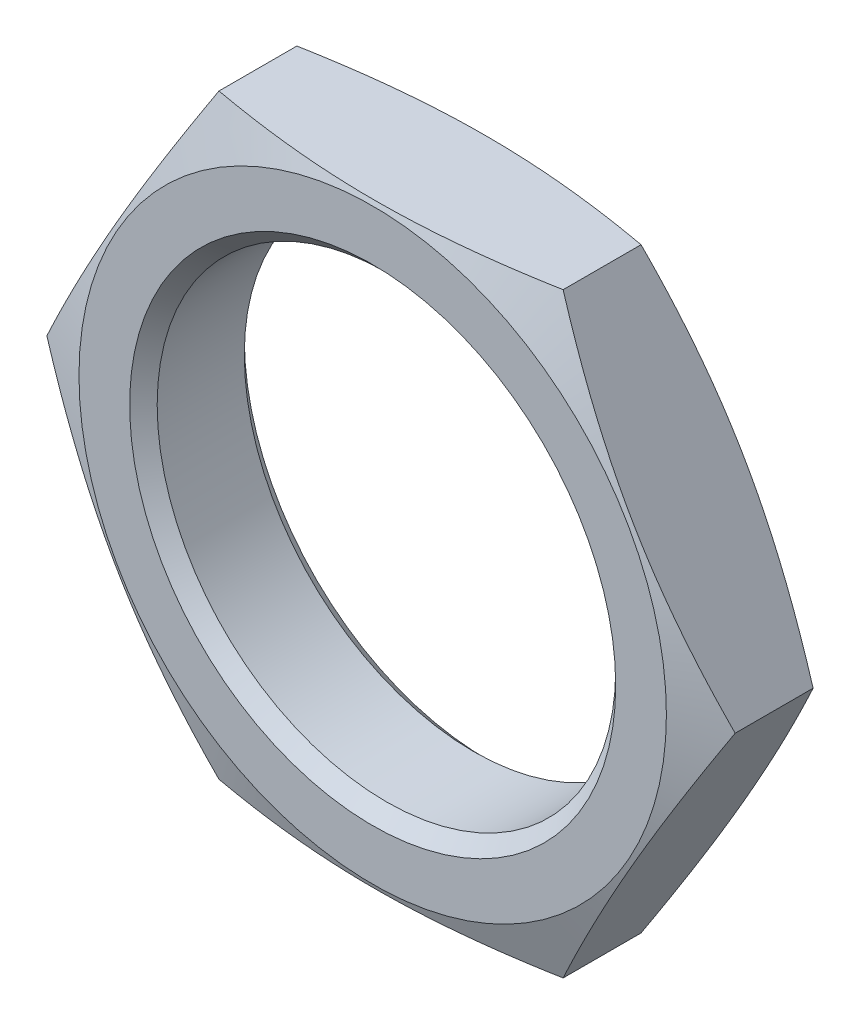
ISO-10303-21;
HEADER;
FILE_DESCRIPTION(('STEP AP214'),'2;1');
FILE_NAME('part.step','',(''),(''),'','','');
FILE_SCHEMA(('AUTOMOTIVE_DESIGN { 1 0 10303 214 1 1 1 1 }'));
ENDSEC;
DATA;
#1=APPLICATION_CONTEXT('core data for automotive mechanical design processes');
#2=APPLICATION_PROTOCOL_DEFINITION('international standard','automotive_design',2000,#1);
#3=PRODUCT_CONTEXT('',#1,'mechanical');
#4=PRODUCT('Part','Part','',(#3));
#5=PRODUCT_RELATED_PRODUCT_CATEGORY('part','',(#4));
#6=PRODUCT_DEFINITION_FORMATION('','',#4);
#7=PRODUCT_DEFINITION_CONTEXT('part definition',#1,'design');
#8=PRODUCT_DEFINITION('design','',#6,#7);
#9=PRODUCT_DEFINITION_SHAPE('','',#8);
#10=(LENGTH_UNIT() NAMED_UNIT(*) SI_UNIT(.MILLI.,.METRE.));
#11=(NAMED_UNIT(*) PLANE_ANGLE_UNIT() SI_UNIT($,.RADIAN.));
#12=(NAMED_UNIT(*) SI_UNIT($,.STERADIAN.) SOLID_ANGLE_UNIT());
#13=UNCERTAINTY_MEASURE_WITH_UNIT(LENGTH_MEASURE(1.E-05),#10,'distance_accuracy_value','');
#14=(GEOMETRIC_REPRESENTATION_CONTEXT(3) GLOBAL_UNCERTAINTY_ASSIGNED_CONTEXT((#13)) GLOBAL_UNIT_ASSIGNED_CONTEXT((#10,
#11,#12)) REPRESENTATION_CONTEXT('',''));
#15=CARTESIAN_POINT('',(0.,0.,0.));
#16=DIRECTION('',(0.,0.,1.));
#17=DIRECTION('',(1.,0.,0.));
#18=AXIS2_PLACEMENT_3D('',#15,#16,#17);
#19=CARTESIAN_POINT('',(7.50555349946514,0.,2.5));
#20=DIRECTION('',(0.,0.,1.));
#21=DIRECTION('',(1.,0.,0.));
#22=AXIS2_PLACEMENT_3D('',#19,#20,#21);
#23=PLANE('',#22);
#24=CARTESIAN_POINT('',(0.,0.,2.5));
#25=DIRECTION('',(0.,0.,1.));
#26=DIRECTION('',(1.,0.,0.));
#27=AXIS2_PLACEMENT_3D('',#24,#25,#26);
#28=CIRCLE('',#27,5.3);
#29=CARTESIAN_POINT('',(5.3,0.,2.5));
#30=VERTEX_POINT('',#29);
#31=EDGE_CURVE('E41',#30,#30,#28,.F.);
#32=ORIENTED_EDGE('',*,*,#31,.T.);
#33=EDGE_LOOP('',(#32));
#34=FACE_BOUND('',#33,.T.);
#35=CARTESIAN_POINT('',(0.,0.,2.5));
#36=DIRECTION('',(0.,0.,-1.));
#37=DIRECTION('',(-1.,0.,0.));
#38=AXIS2_PLACEMENT_3D('',#35,#36,#37);
#39=CIRCLE('',#38,6.40555349946513);
#40=CARTESIAN_POINT('',(-6.40555349946513,0.,2.5));
#41=VERTEX_POINT('',#40);
#42=EDGE_CURVE('E288',#41,#41,#39,.T.);
#43=ORIENTED_EDGE('',*,*,#42,.F.);
#44=EDGE_LOOP('',(#43));
#45=FACE_BOUND('',#44,.T.);
#46=ADVANCED_FACE('F33',(#34,#45),#23,.T.);
#47=CARTESIAN_POINT('',(7.50555349946514,0.,0.));
#48=DIRECTION('',(0.,0.,1.));
#49=DIRECTION('',(1.,0.,0.));
#50=AXIS2_PLACEMENT_3D('',#47,#48,#49);
#51=PLANE('',#50);
#52=CARTESIAN_POINT('',(0.,0.,0.));
#53=DIRECTION('',(0.,0.,1.));
#54=DIRECTION('',(1.,0.,0.));
#55=AXIS2_PLACEMENT_3D('',#52,#53,#54);
#56=CIRCLE('',#55,5.3);
#57=CARTESIAN_POINT('',(-5.3,0.,0.));
#58=VERTEX_POINT('',#57);
#59=EDGE_CURVE('E11',#58,#58,#56,.T.);
#60=ORIENTED_EDGE('',*,*,#59,.T.);
#61=EDGE_LOOP('',(#60));
#62=FACE_BOUND('',#61,.T.);
#63=CARTESIAN_POINT('',(0.,0.,0.));
#64=DIRECTION('',(0.,0.,-1.));
#65=DIRECTION('',(-1.,0.,0.));
#66=AXIS2_PLACEMENT_3D('',#63,#64,#65);
#67=CIRCLE('',#66,6.40555349946513);
#68=CARTESIAN_POINT('',(-6.40555349946513,0.,0.));
#69=VERTEX_POINT('',#68);
#70=EDGE_CURVE('E101',#69,#69,#67,.T.);
#71=ORIENTED_EDGE('',*,*,#70,.T.);
#72=EDGE_LOOP('',(#71));
#73=FACE_BOUND('',#72,.T.);
#74=ADVANCED_FACE('F140',(#62,#73),#51,.F.);
#75=CARTESIAN_POINT('',(0.,0.,2.5));
#76=DIRECTION('',(0.,0.,-1.));
#77=DIRECTION('',(-1.,0.,0.));
#78=AXIS2_PLACEMENT_3D('',#75,#76,#77);
#79=CYLINDRICAL_SURFACE('',#78,5.);
#80=CARTESIAN_POINT('',(0.,0.,2.2));
#81=DIRECTION('',(0.,0.,1.));
#82=DIRECTION('',(1.,0.,0.));
#83=AXIS2_PLACEMENT_3D('',#80,#81,#82);
#84=CIRCLE('',#83,5.);
#85=CARTESIAN_POINT('',(5.,0.,2.2));
#86=VERTEX_POINT('',#85);
#87=EDGE_CURVE('E226',#86,#86,#84,.T.);
#88=ORIENTED_EDGE('',*,*,#87,.T.);
#89=EDGE_LOOP('',(#88));
#90=FACE_BOUND('',#89,.T.);
#91=CARTESIAN_POINT('',(0.,0.,0.300000000000001));
#92=DIRECTION('',(0.,0.,1.));
#93=DIRECTION('',(1.,0.,0.));
#94=AXIS2_PLACEMENT_3D('',#91,#92,#93);
#95=CIRCLE('',#94,5.);
#96=CARTESIAN_POINT('',(-5.,0.,0.300000000000001));
#97=VERTEX_POINT('',#96);
#98=EDGE_CURVE('E224',#97,#97,#95,.F.);
#99=ORIENTED_EDGE('',*,*,#98,.T.);
#100=EDGE_LOOP('',(#99));
#101=FACE_BOUND('',#100,.T.);
#102=ADVANCED_FACE('F174',(#90,#101),#79,.F.);
#103=CARTESIAN_POINT('',(0.,0.,2.5));
#104=DIRECTION('',(0.,0.,-1.));
#105=DIRECTION('',(-1.,0.,0.));
#106=AXIS2_PLACEMENT_3D('',#103,#104,#105);
#107=CONICAL_SURFACE('',#106,6.40555349946513,1.22173047639604);
#108=ORIENTED_EDGE('',*,*,#42,.T.);
#109=EDGE_LOOP('',(#108));
#110=FACE_BOUND('',#109,.T.);
#111=CARTESIAN_POINT('',(3.75266127967873,6.5002,2.09959071367478));
#112=CARTESIAN_POINT('',(3.90808152872781,6.23100423212198,2.15618026455006));
#113=CARTESIAN_POINT('',(4.06401428759355,5.96092077120214,2.20765825923382));
#114=CARTESIAN_POINT('',(4.37689369909253,5.41899773384365,2.29822583156439));
#115=CARTESIAN_POINT('',(4.53384104768271,5.14715695197224,2.3373057151002));
#116=CARTESIAN_POINT('',(4.84700787795209,4.60473609070038,2.40051630902823));
#117=CARTESIAN_POINT('',(5.00322020758408,4.33416839900908,2.42478489181156));
#118=CARTESIAN_POINT('',(5.31601017237547,3.7924002878927,2.45733588263114));
#119=CARTESIAN_POINT('',(5.47258764848716,3.52120014394635,2.4656242850747));
#120=CARTESIAN_POINT('',(5.78574260071054,2.97879985605365,2.4656242850747));
#121=CARTESIAN_POINT('',(5.94232007682223,2.70759971210731,2.45733588263114));
#122=CARTESIAN_POINT('',(6.25511004161363,2.16583160099093,2.42478489181156));
#123=CARTESIAN_POINT('',(6.41132237124562,1.89526390929962,2.40051630902823));
#124=CARTESIAN_POINT('',(6.724489201515,1.35284304802776,2.3373057151002));
#125=CARTESIAN_POINT('',(6.88143655010517,1.08100226615635,2.29822583156439));
#126=CARTESIAN_POINT('',(7.19431596160416,0.53907922879786,2.20765825923382));
#127=CARTESIAN_POINT('',(7.35024872046989,0.268995767878023,2.15618026455006));
#128=CARTESIAN_POINT('',(7.50566896951898,-0.000199999999998173,2.09959071367478));
#129=B_SPLINE_CURVE_WITH_KNOTS('',3,(#111,#112,#113,#114,#115,#116,#117,#118,#119,#120,#121,
#122,#123,#124,#125,#126,#127,#128),.UNSPECIFIED.,.F.,.F.,(4,2,2,2,2,2,2,2,4),(0.,
0.947946776379686,1.89663293805397,2.83634783106806,3.77571015417899,4.71507247728992,
5.65478737030401,6.6034735319783,7.55142030835799),.UNSPECIFIED.);
#130=CARTESIAN_POINT('',(3.75277674973256,6.5,2.09963274230719));
#131=VERTEX_POINT('',#130);
#132=CARTESIAN_POINT('',(7.50555349946513,0.,2.09963274230719));
#133=VERTEX_POINT('',#132);
#134=EDGE_CURVE('E204',#131,#133,#129,.T.);
#135=ORIENTED_EDGE('',*,*,#134,.F.);
#136=CARTESIAN_POINT('',(-9.93275899222468,6.5,0.510907869732788));
#137=CARTESIAN_POINT('',(-9.63870911944885,6.5,0.600437082830748));
#138=CARTESIAN_POINT('',(-9.34433502778617,6.5,0.688920880606083));
#139=CARTESIAN_POINT('',(-8.75477335186116,6.5,0.863219312127888));
#140=CARTESIAN_POINT('',(-8.45958570515685,6.5,0.949033734411754));
#141=CARTESIAN_POINT('',(-7.86772589272142,6.5,1.1175580355949));
#142=CARTESIAN_POINT('',(-7.57105198379428,6.5,1.20026181442368));
#143=CARTESIAN_POINT('',(-6.97660010973156,6.5,1.36159573798118));
#144=CARTESIAN_POINT('',(-6.67882216454635,6.5,1.44022595593997));
#145=CARTESIAN_POINT('',(-6.0856494027665,6.5,1.59146429368655));
#146=CARTESIAN_POINT('',(-5.79027056956455,6.5,1.66413479120679));
#147=CARTESIAN_POINT('',(-5.19804269152195,6.5,1.80328382457062));
#148=CARTESIAN_POINT('',(-4.90119362201958,6.5,1.86976225617561));
#149=CARTESIAN_POINT('',(-4.30595945116437,6.5,1.99497621355401));
#150=CARTESIAN_POINT('',(-4.00757491252028,6.5,2.05371439141901));
#151=CARTESIAN_POINT('',(-3.40907368020393,6.5,2.16165838207241));
#152=CARTESIAN_POINT('',(-3.10895704498934,6.5,2.21086451464908));
#153=CARTESIAN_POINT('',(-2.54079199290976,6.5,2.29287222030263));
#154=CARTESIAN_POINT('',(-2.27292144156964,6.5,2.32689460192451));
#155=CARTESIAN_POINT('',(-1.73604864875956,6.5,2.38447547805281));
#156=CARTESIAN_POINT('',(-1.46704644051218,6.5,2.40803427760907));
#157=CARTESIAN_POINT('',(-0.928456023934898,6.5,2.44355339641723));
#158=CARTESIAN_POINT('',(-0.658868364604204,6.5,2.45552190685085));
#159=CARTESIAN_POINT('',(-0.119424768576256,6.5,2.46725457871077));
#160=CARTESIAN_POINT('',(0.150431166231241,6.5,2.46701882550436));
#161=CARTESIAN_POINT('',(0.691222354829804,6.5,2.45432362489183));
#162=CARTESIAN_POINT('',(0.962156126616377,6.5,2.44180208033203));
#163=CARTESIAN_POINT('',(1.50322700392022,6.5,2.405111435728));
#164=CARTESIAN_POINT('',(1.77336409014416,6.5,2.38094205590105));
#165=CARTESIAN_POINT('',(2.3127085620057,6.5,2.32208568457574));
#166=CARTESIAN_POINT('',(2.58191494810802,6.5,2.28738966430886));
#167=CARTESIAN_POINT('',(3.11898092131291,6.5,2.20888641586176));
#168=CARTESIAN_POINT('',(3.38684050128898,6.5,2.16507913952199));
#169=CARTESIAN_POINT('',(3.93553916779552,6.5,2.06721626703214));
#170=CARTESIAN_POINT('',(4.21630189928685,6.5,2.01273633647298));
#171=CARTESIAN_POINT('',(4.77638486124891,6.5,1.89676528295006));
#172=CARTESIAN_POINT('',(5.05570498114296,6.5,1.83527363063384));
#173=CARTESIAN_POINT('',(5.61310218277813,6.5,1.70657116145931));
#174=CARTESIAN_POINT('',(5.89117887813179,6.5,1.63935868144713));
#175=CARTESIAN_POINT('',(6.446160536878,6.5,1.50030796854168));
#176=CARTESIAN_POINT('',(6.72306552823429,6.5,1.42846984671459));
#177=CARTESIAN_POINT('',(7.27622308559355,6.5,1.28093994281292));
#178=CARTESIAN_POINT('',(7.55247436302845,6.5,1.20524334633924));
#179=CARTESIAN_POINT('',(8.10411533639781,6.5,1.05076765368658));
#180=CARTESIAN_POINT('',(8.37950501958364,6.5,0.971988512127318));
#181=CARTESIAN_POINT('',(9.20447680240312,6.5,0.73191185613646));
#182=CARTESIAN_POINT('',(9.75296208285111,6.5,0.566847858827857));
#183=CARTESIAN_POINT('',(10.8417284979879,6.5,0.231703758812674));
#184=CARTESIAN_POINT('',(11.3820331821249,6.5,0.0616995360075588));
#185=CARTESIAN_POINT('',(12.461125816557,6.5,-0.283134564070289));
#186=CARTESIAN_POINT('',(12.9999136926156,6.5,-0.457964673160328));
#187=CARTESIAN_POINT('',(14.0742870640673,6.5,-0.810481151950385));
#188=CARTESIAN_POINT('',(14.6098769528312,6.5,-0.988154164104569));
#189=CARTESIAN_POINT('',(15.4125775311772,6.5,-1.2566335148674));
#190=CARTESIAN_POINT('',(15.6800195860248,6.5,-1.34645127854686));
#191=CARTESIAN_POINT('',(16.2147073059903,6.5,-1.52666742335223));
#192=CARTESIAN_POINT('',(16.4819529715845,6.5,-1.61706580306497));
#193=CARTESIAN_POINT('',(16.7491133296354,6.5,-1.70771556414892));
#194=B_SPLINE_CURVE_WITH_KNOTS('',3,(#136,#137,#138,#139,#140,#141,#142,#143,#144,#145,#146,
#147,#148,#149,#150,#151,#152,#153,#154,#155,#156,#157,#158,#159,#160,#161,#162,#163,#164,#165,
#166,#167,#168,#169,#170,#171,#172,#173,#174,#175,#176,#177,#178,#179,#180,#181,#182,#183,#184,
#185,#186,#187,#188,#189,#190,#191,#192,#193),.UNSPECIFIED.,.F.,.F.,(4,2,2,2,2,2,2,2,2,2,2,2,2,
2,2,2,2,2,2,2,2,2,2,2,2,2,2,2,4),(0.,0.92213845607072,1.84434977703187,2.76828414967968,
3.69220190706714,4.60470980156526,5.517233054649,6.42944282666858,7.34162198988032,
8.15151158396813,8.96137756540534,9.77067077328066,10.5799583202531,11.393357502964,
12.2067762246183,13.0208946026985,13.8350172840893,14.6929062883346,15.5508601021541,
16.4090641970774,17.2672476933581,18.1265295273765,18.9858240162436,20.7041008127213,
22.4033317453919,24.1026444452187,25.7955082008592,26.6418718771575,27.4882334942658),.UNSPECIFIED.);
#195=CARTESIAN_POINT('',(-3.75277674973257,6.5,2.09963274230719));
#196=VERTEX_POINT('',#195);
#197=EDGE_CURVE('E87',#196,#131,#194,.T.);
#198=ORIENTED_EDGE('',*,*,#197,.F.);
#199=CARTESIAN_POINT('',(-7.50566896951897,-0.000199999999998311,2.09959071367479));
#200=CARTESIAN_POINT('',(-7.35024872046989,0.268995767878023,2.15618026455006));
#201=CARTESIAN_POINT('',(-7.19431596160415,0.53907922879786,2.20765825923382));
#202=CARTESIAN_POINT('',(-6.88143655010517,1.08100226615635,2.2982258315644));
#203=CARTESIAN_POINT('',(-6.72448920151499,1.35284304802776,2.3373057151002));
#204=CARTESIAN_POINT('',(-6.41132237124561,1.89526390929962,2.40051630902823));
#205=CARTESIAN_POINT('',(-6.25511004161362,2.16583160099093,2.42478489181156));
#206=CARTESIAN_POINT('',(-5.94232007682223,2.70759971210731,2.45733588263114));
#207=CARTESIAN_POINT('',(-5.78574260071054,2.97879985605365,2.4656242850747));
#208=CARTESIAN_POINT('',(-5.47258764848716,3.52120014394635,2.4656242850747));
#209=CARTESIAN_POINT('',(-5.31601017237547,3.7924002878927,2.45733588263114));
#210=CARTESIAN_POINT('',(-5.00322020758407,4.33416839900908,2.42478489181156));
#211=CARTESIAN_POINT('',(-4.84700787795208,4.60473609070038,2.40051630902823));
#212=CARTESIAN_POINT('',(-4.53384104768271,5.14715695197224,2.3373057151002));
#213=CARTESIAN_POINT('',(-4.37689369909253,5.41899773384365,2.29822583156439));
#214=CARTESIAN_POINT('',(-4.06401428759354,5.96092077120214,2.20765825923382));
#215=CARTESIAN_POINT('',(-3.90808152872781,6.23100423212198,2.15618026455006));
#216=CARTESIAN_POINT('',(-3.75266127967873,6.5002,2.09959071367478));
#217=B_SPLINE_CURVE_WITH_KNOTS('',3,(#199,#200,#201,#202,#203,#204,#205,#206,#207,#208,#209,
#210,#211,#212,#213,#214,#215,#216),.UNSPECIFIED.,.F.,.F.,(4,2,2,2,2,2,2,2,4),(0.,
0.947946776379687,1.89663293805397,2.83634783106806,3.77571015417899,4.71507247728992,
5.65478737030401,6.6034735319783,7.55142030835798),.UNSPECIFIED.);
#218=CARTESIAN_POINT('',(-7.50555349946513,0.,2.09963274230719));
#219=VERTEX_POINT('',#218);
#220=EDGE_CURVE('E84',#219,#196,#217,.T.);
#221=ORIENTED_EDGE('',*,*,#220,.F.);
#222=CARTESIAN_POINT('',(-3.75266127967872,-6.5002,2.09959071367479));
#223=CARTESIAN_POINT('',(-3.90808152872781,-6.23100423212198,2.15618026455006));
#224=CARTESIAN_POINT('',(-4.06401428759354,-5.96092077120214,2.20765825923383));
#225=CARTESIAN_POINT('',(-4.37689369909253,-5.41899773384365,2.2982258315644));
#226=CARTESIAN_POINT('',(-4.53384104768271,-5.14715695197224,2.33730571510021));
#227=CARTESIAN_POINT('',(-4.84700787795208,-4.60473609070038,2.40051630902823));
#228=CARTESIAN_POINT('',(-5.00322020758407,-4.33416839900907,2.42478489181156));
#229=CARTESIAN_POINT('',(-5.31601017237547,-3.79240028789269,2.45733588263114));
#230=CARTESIAN_POINT('',(-5.47258764848716,-3.52120014394635,2.4656242850747));
#231=CARTESIAN_POINT('',(-5.78574260071054,-2.97879985605365,2.4656242850747));
#232=CARTESIAN_POINT('',(-5.94232007682223,-2.7075997121073,2.45733588263114));
#233=CARTESIAN_POINT('',(-6.25511004161362,-2.16583160099092,2.42478489181156));
#234=CARTESIAN_POINT('',(-6.41132237124561,-1.89526390929962,2.40051630902823));
#235=CARTESIAN_POINT('',(-6.72448920151499,-1.35284304802776,2.3373057151002));
#236=CARTESIAN_POINT('',(-6.88143655010517,-1.08100226615635,2.2982258315644));
#237=CARTESIAN_POINT('',(-7.19431596160415,-0.539079228797856,2.20765825923382));
#238=CARTESIAN_POINT('',(-7.35024872046989,-0.268995767878018,2.15618026455006));
#239=CARTESIAN_POINT('',(-7.50566896951897,0.000200000000002948,2.09959071367478));
#240=B_SPLINE_CURVE_WITH_KNOTS('',3,(#222,#223,#224,#225,#226,#227,#228,#229,#230,#231,#232,
#233,#234,#235,#236,#237,#238,#239),.UNSPECIFIED.,.F.,.F.,(4,2,2,2,2,2,2,2,4),(0.,
0.947946776379687,1.89663293805397,2.83634783106806,3.77571015417899,4.71507247728993,
5.65478737030402,6.6034735319783,7.55142030835799),.UNSPECIFIED.);
#241=CARTESIAN_POINT('',(-3.75277674973256,-6.5,2.09963274230719));
#242=VERTEX_POINT('',#241);
#243=EDGE_CURVE('E48',#242,#219,#240,.T.);
#244=ORIENTED_EDGE('',*,*,#243,.F.);
#245=CARTESIAN_POINT('',(-9.93276189784654,-6.5,0.510906984811928));
#246=CARTESIAN_POINT('',(-9.63871191253973,-6.5,0.600436240016));
#247=CARTESIAN_POINT('',(-9.34433770828217,-6.5,0.688920079784879));
#248=CARTESIAN_POINT('',(-8.75477580692674,-6.5,0.863218594789617));
#249=CARTESIAN_POINT('',(-8.45958804738685,-6.5,0.949033058562787));
#250=CARTESIAN_POINT('',(-7.86772800823222,-6.5,1.11755744215384));
#251=CARTESIAN_POINT('',(-7.57105398541923,-6.5,1.20026126189408));
#252=CARTESIAN_POINT('',(-6.9766018831109,-6.5,1.36159526598626));
#253=CARTESIAN_POINT('',(-6.67882382356595,-6.5,1.44022552356833));
#254=CARTESIAN_POINT('',(-6.0856508338216,-6.5,1.59146393808161));
#255=CARTESIAN_POINT('',(-5.79027188702323,-6.5,1.66413447277002));
#256=CARTESIAN_POINT('',(-5.19804378087725,-6.5,1.80328357750695));
#257=CARTESIAN_POINT('',(-4.90119459686782,-6.5,1.86976204331649));
#258=CARTESIAN_POINT('',(-4.30596019612146,-6.5,1.99497606462943));
#259=CARTESIAN_POINT('',(-4.00757554209493,-6.5,2.05371427223186));
#260=CARTESIAN_POINT('',(-3.40907407769726,-6.5,2.16165831601635));
#261=CARTESIAN_POINT('',(-3.1089573257841,-6.5,2.21086447198834));
#262=CARTESIAN_POINT('',(-2.54079218412746,-6.5,2.29287219459378));
#263=CARTESIAN_POINT('',(-2.27292166070283,-6.5,2.32689457517852));
#264=CARTESIAN_POINT('',(-1.73604892387347,-6.5,2.38447545178699));
#265=CARTESIAN_POINT('',(-1.46704674369131,-6.5,2.4080342528605));
#266=CARTESIAN_POINT('',(-0.928456383184646,-6.5,2.44355337747323));
#267=CARTESIAN_POINT('',(-0.658868751859281,-6.5,2.45552189219126));
#268=CARTESIAN_POINT('',(-0.119425211615149,-6.5,2.46725457531023));
#269=CARTESIAN_POINT('',(0.150430695413859,-6.5,2.46701882907846));
#270=CARTESIAN_POINT('',(0.69122182770532,-6.5,2.45432364478442));
#271=CARTESIAN_POINT('',(0.962155570966412,-6.5,2.44180210962608));
#272=CARTESIAN_POINT('',(1.50322639170744,-6.5,2.40511148563412));
#273=CARTESIAN_POINT('',(1.77336344989406,-6.5,2.38094211701802));
#274=CARTESIAN_POINT('',(2.31270786604379,-6.5,2.32208576928847));
#275=CARTESIAN_POINT('',(2.58191422447237,-6.5,2.28738976141092));
#276=CARTESIAN_POINT('',(3.11898014271621,-6.5,2.20888653834754));
#277=CARTESIAN_POINT('',(3.38683969540497,-6.5,2.16507927500219));
#278=CARTESIAN_POINT('',(3.93553833456393,-6.5,2.06721642434416));
#279=CARTESIAN_POINT('',(4.21630106585542,-6.5,2.01273650177249));
#280=CARTESIAN_POINT('',(4.77638402732769,-6.5,1.89676546289531));
#281=CARTESIAN_POINT('',(5.05570414693175,-6.5,1.83527381723701));
#282=CARTESIAN_POINT('',(5.61310134788561,-6.5,1.70657136025225));
#283=CARTESIAN_POINT('',(5.89117804284776,-6.5,1.63935888577084));
#284=CARTESIAN_POINT('',(6.44615970065959,-6.5,1.50030818301143));
#285=CARTESIAN_POINT('',(6.72306469147305,-6.5,1.42847006579969));
#286=CARTESIAN_POINT('',(7.27622224789133,-6.5,1.28094017032186));
#287=CARTESIAN_POINT('',(7.55247352492687,-6.5,1.20524357765181));
#288=CARTESIAN_POINT('',(8.10411449736909,-6.5,1.05076789201081));
#289=CARTESIAN_POINT('',(8.37950418002712,-6.5,0.971988753659539));
#290=CARTESIAN_POINT('',(9.20447596105749,-6.5,0.731912106598012));
#291=CARTESIAN_POINT('',(9.75296124007728,-6.5,0.566848114306947));
#292=CARTESIAN_POINT('',(10.8417276610175,-6.5,0.231704020326909));
#293=CARTESIAN_POINT('',(11.3820323523552,-6.5,0.0616997984410296));
#294=CARTESIAN_POINT('',(12.4611250009329,-6.5,-0.283134300704948));
#295=CARTESIAN_POINT('',(12.9999128839365,-6.5,-0.457964409782483));
#296=CARTESIAN_POINT('',(14.0742862679627,-6.5,-0.810480888787709));
#297=CARTESIAN_POINT('',(14.6098761623592,-6.5,-0.98815390116008));
#298=CARTESIAN_POINT('',(15.4125767490493,-6.5,-1.25663325255006));
#299=CARTESIAN_POINT('',(15.6800188066567,-6.5,-1.34645101648715));
#300=CARTESIAN_POINT('',(16.214706532114,-6.5,-1.52666716189332));
#301=CARTESIAN_POINT('',(16.4819522004402,-6.5,-1.61706554194924));
#302=CARTESIAN_POINT('',(16.7491125612117,-6.5,-1.70771530341158));
#303=B_SPLINE_CURVE_WITH_KNOTS('',3,(#245,#246,#247,#248,#249,#250,#251,#252,#253,#254,#255,
#256,#257,#258,#259,#260,#261,#262,#263,#264,#265,#266,#267,#268,#269,#270,#271,#272,#273,#274,
#275,#276,#277,#278,#279,#280,#281,#282,#283,#284,#285,#286,#287,#288,#289,#290,#291,#292,#293,
#294,#295,#296,#297,#298,#299,#300,#301,#302),.UNSPECIFIED.,.F.,.F.,(4,2,2,2,2,2,2,2,2,2,2,2,2,
2,2,2,2,2,2,2,2,2,2,2,2,2,2,2,4),(0.,0.922138815821408,1.84435049657785,2.76828523128836,
3.69220335072206,4.6047116027551,5.51723521342521,6.42944534220805,7.34162486203661,
8.15151437273022,8.9613802707751,9.77067339538366,10.5799608590891,11.3933599550802,
12.2067785899975,13.0208968809996,13.8350194753101,14.6929084743591,15.5508622830076,
16.4090663728718,17.2672498640866,18.1265316939255,18.9858261786181,20.7041029666273,
22.4033339190661,24.1026466386931,25.7955104105753,26.641874094968,27.48823572017),.UNSPECIFIED.);
#304=CARTESIAN_POINT('',(3.75277674973256,-6.5,2.09963274230719));
#305=VERTEX_POINT('',#304);
#306=EDGE_CURVE('E119',#305,#242,#303,.F.);
#307=ORIENTED_EDGE('',*,*,#306,.F.);
#308=CARTESIAN_POINT('',(7.50566896951898,0.000200000000001085,2.09959071367478));
#309=CARTESIAN_POINT('',(7.35024872046989,-0.268995767878019,2.15618026455006));
#310=CARTESIAN_POINT('',(7.19431596160416,-0.539079228797857,2.20765825923382));
#311=CARTESIAN_POINT('',(6.88143655010517,-1.08100226615635,2.29822583156439));
#312=CARTESIAN_POINT('',(6.724489201515,-1.35284304802776,2.3373057151002));
#313=CARTESIAN_POINT('',(6.41132237124562,-1.89526390929962,2.40051630902823));
#314=CARTESIAN_POINT('',(6.25511004161363,-2.16583160099092,2.42478489181156));
#315=CARTESIAN_POINT('',(5.94232007682223,-2.7075997121073,2.45733588263114));
#316=CARTESIAN_POINT('',(5.78574260071055,-2.97879985605365,2.4656242850747));
#317=CARTESIAN_POINT('',(5.47258764848717,-3.52120014394634,2.4656242850747));
#318=CARTESIAN_POINT('',(5.31601017237548,-3.79240028789269,2.45733588263114));
#319=CARTESIAN_POINT('',(5.00322020758408,-4.33416839900907,2.42478489181156));
#320=CARTESIAN_POINT('',(4.84700787795209,-4.60473609070037,2.40051630902823));
#321=CARTESIAN_POINT('',(4.53384104768271,-5.14715695197223,2.3373057151002));
#322=CARTESIAN_POINT('',(4.37689369909254,-5.41899773384364,2.29822583156439));
#323=CARTESIAN_POINT('',(4.06401428759355,-5.96092077120214,2.20765825923382));
#324=CARTESIAN_POINT('',(3.90808152872782,-6.23100423212198,2.15618026455006));
#325=CARTESIAN_POINT('',(3.75266127967873,-6.5002,2.09959071367478));
#326=B_SPLINE_CURVE_WITH_KNOTS('',3,(#308,#309,#310,#311,#312,#313,#314,#315,#316,#317,#318,
#319,#320,#321,#322,#323,#324,#325),.UNSPECIFIED.,.F.,.F.,(4,2,2,2,2,2,2,2,4),(0.,
0.947946776379687,1.89663293805397,2.83634783106806,3.77571015417899,4.71507247728992,
5.65478737030401,6.6034735319783,7.55142030835798),.UNSPECIFIED.);
#327=EDGE_CURVE('E160',#133,#305,#326,.T.);
#328=ORIENTED_EDGE('',*,*,#327,.F.);
#329=EDGE_LOOP('',(#135,#198,#221,#244,#307,#328));
#330=FACE_BOUND('',#329,.T.);
#331=ADVANCED_FACE('F85',(#110,#330),#107,.T.);
#332=CARTESIAN_POINT('',(0.,0.,0.400367257692815));
#333=DIRECTION('',(0.,0.,1.));
#334=DIRECTION('',(1.,0.,0.));
#335=AXIS2_PLACEMENT_3D('',#332,#333,#334);
#336=CONICAL_SURFACE('',#335,7.50555349946513,1.22173047639604);
#337=ORIENTED_EDGE('',*,*,#70,.F.);
#338=EDGE_LOOP('',(#337));
#339=FACE_BOUND('',#338,.T.);
#340=CARTESIAN_POINT('',(-9.93276189784654,-6.5,1.98909301518807));
#341=CARTESIAN_POINT('',(-9.63871191253973,-6.5,1.899563759984));
#342=CARTESIAN_POINT('',(-9.34433770828217,-6.5,1.81107992021512));
#343=CARTESIAN_POINT('',(-8.75477580692675,-6.5,1.63678140521039));
#344=CARTESIAN_POINT('',(-8.45958804738685,-6.5,1.55096694143722));
#345=CARTESIAN_POINT('',(-7.86772800823222,-6.5,1.38244255784616));
#346=CARTESIAN_POINT('',(-7.57105398541923,-6.5,1.29973873810592));
#347=CARTESIAN_POINT('',(-6.97660188311091,-6.5,1.13840473401375));
#348=CARTESIAN_POINT('',(-6.67882382356595,-6.5,1.05977447643167));
#349=CARTESIAN_POINT('',(-6.0856508338216,-6.5,0.908536061918396));
#350=CARTESIAN_POINT('',(-5.79027188702324,-6.5,0.835865527229985));
#351=CARTESIAN_POINT('',(-5.19804378087725,-6.5,0.696716422493055));
#352=CARTESIAN_POINT('',(-4.90119459686782,-6.5,0.630237956683508));
#353=CARTESIAN_POINT('',(-4.30596019612146,-6.5,0.505023935370566));
#354=CARTESIAN_POINT('',(-4.00757554209493,-6.5,0.446285727768145));
#355=CARTESIAN_POINT('',(-3.40907407769726,-6.5,0.338341683983648));
#356=CARTESIAN_POINT('',(-3.1089573257841,-6.5,0.289135528011665));
#357=CARTESIAN_POINT('',(-2.54079218412746,-6.5,0.207127805406216));
#358=CARTESIAN_POINT('',(-2.27292166070283,-6.5,0.173105424821484));
#359=CARTESIAN_POINT('',(-1.73604892387347,-6.5,0.115524548213011));
#360=CARTESIAN_POINT('',(-1.46704674369131,-6.5,0.0919657471395011));
#361=CARTESIAN_POINT('',(-0.928456383184647,-6.5,0.0564466225267671));
#362=CARTESIAN_POINT('',(-0.658868751859281,-6.5,0.0444781078087433));
#363=CARTESIAN_POINT('',(-0.119425211615151,-6.5,0.0327454246897682));
#364=CARTESIAN_POINT('',(0.150430695413857,-6.5,0.0329811709215425));
#365=CARTESIAN_POINT('',(0.691221827705318,-6.5,0.0456763552155829));
#366=CARTESIAN_POINT('',(0.962155570966409,-6.5,0.0581978903739236));
#367=CARTESIAN_POINT('',(1.50322639170743,-6.5,0.094888514365883));
#368=CARTESIAN_POINT('',(1.77336344989406,-6.5,0.11905788298198));
#369=CARTESIAN_POINT('',(2.31270786604378,-6.5,0.177914230711533));
#370=CARTESIAN_POINT('',(2.58191422447237,-6.5,0.212610238589076));
#371=CARTESIAN_POINT('',(3.1189801427162,-6.5,0.291113461652456));
#372=CARTESIAN_POINT('',(3.38683969540496,-6.5,0.334920724997812));
#373=CARTESIAN_POINT('',(3.93553833456392,-6.5,0.432783575655841));
#374=CARTESIAN_POINT('',(4.21630106585541,-6.5,0.487263498227505));
#375=CARTESIAN_POINT('',(4.77638402732768,-6.5,0.603234537104692));
#376=CARTESIAN_POINT('',(5.05570414693174,-6.5,0.664726182762987));
#377=CARTESIAN_POINT('',(5.6131013478856,-6.5,0.793428639747746));
#378=CARTESIAN_POINT('',(5.89117804284775,-6.5,0.86064111422916));
#379=CARTESIAN_POINT('',(6.44615970065959,-6.5,0.999691816988569));
#380=CARTESIAN_POINT('',(6.72306469147304,-6.5,1.07152993420031));
#381=CARTESIAN_POINT('',(7.27622224789132,-6.5,1.21905982967814));
#382=CARTESIAN_POINT('',(7.55247352492686,-6.5,1.29475642234819));
#383=CARTESIAN_POINT('',(8.10411449736908,-6.5,1.44923210798919));
#384=CARTESIAN_POINT('',(8.37950418002712,-6.5,1.52801124634046));
#385=CARTESIAN_POINT('',(9.20447596105748,-6.5,1.76808789340199));
#386=CARTESIAN_POINT('',(9.75296124007727,-6.5,1.93315188569305));
#387=CARTESIAN_POINT('',(10.8417276610175,-6.5,2.26829597967309));
#388=CARTESIAN_POINT('',(11.3820323523552,-6.5,2.43830020155897));
#389=CARTESIAN_POINT('',(12.4611250009329,-6.5,2.78313430070495));
#390=CARTESIAN_POINT('',(12.9999128839365,-6.5,2.95796440978248));
#391=CARTESIAN_POINT('',(14.0742862679627,-6.5,3.31048088878771));
#392=CARTESIAN_POINT('',(14.6098761623592,-6.5,3.48815390116008));
#393=CARTESIAN_POINT('',(15.4125767490493,-6.5,3.75663325255007));
#394=CARTESIAN_POINT('',(15.6800188066567,-6.5,3.84645101648716));
#395=CARTESIAN_POINT('',(16.214706532114,-6.5,4.02666716189333));
#396=CARTESIAN_POINT('',(16.4819522004402,-6.5,4.11706554194924));
#397=CARTESIAN_POINT('',(16.7491125612117,-6.5,4.20771530341159));
#398=B_SPLINE_CURVE_WITH_KNOTS('',3,(#340,#341,#342,#343,#344,#345,#346,#347,#348,#349,#350,
#351,#352,#353,#354,#355,#356,#357,#358,#359,#360,#361,#362,#363,#364,#365,#366,#367,#368,#369,
#370,#371,#372,#373,#374,#375,#376,#377,#378,#379,#380,#381,#382,#383,#384,#385,#386,#387,#388,
#389,#390,#391,#392,#393,#394,#395,#396,#397),.UNSPECIFIED.,.F.,.F.,(4,2,2,2,2,2,2,2,2,2,2,2,2,
2,2,2,2,2,2,2,2,2,2,2,2,2,2,2,4),(0.,0.922138815821406,1.84435049657785,2.76828523128836,
3.69220335072206,4.6047116027551,5.51723521342521,6.42944534220805,7.34162486203661,
8.15151437273022,8.9613802707751,9.77067339538366,10.5799608590891,11.3933599550802,
12.2067785899975,13.0208968809996,13.8350194753101,14.6929084743591,15.5508622830076,
16.4090663728718,17.2672498640866,18.1265316939255,18.9858261786181,20.7041029666273,
22.4033339190661,24.1026466386931,25.7955104105753,26.641874094968,27.48823572017),.UNSPECIFIED.);
#399=CARTESIAN_POINT('',(-3.75277674973256,-6.5,0.400367257692815));
#400=VERTEX_POINT('',#399);
#401=CARTESIAN_POINT('',(3.75277674973257,-6.5,0.400367257692815));
#402=VERTEX_POINT('',#401);
#403=EDGE_CURVE('E126',#400,#402,#398,.T.);
#404=ORIENTED_EDGE('',*,*,#403,.F.);
#405=CARTESIAN_POINT('',(-7.50566896951897,0.000200000000001745,0.400409286325215));
#406=CARTESIAN_POINT('',(-7.35024872046989,-0.268995767878018,0.343819735449942));
#407=CARTESIAN_POINT('',(-7.19431596160415,-0.539079228797856,0.292341740766176));
#408=CARTESIAN_POINT('',(-6.88143655010517,-1.08100226615635,0.201774168435605));
#409=CARTESIAN_POINT('',(-6.72448920151499,-1.35284304802776,0.162694284899795));
#410=CARTESIAN_POINT('',(-6.41132237124561,-1.89526390929962,0.0994836909717722));
#411=CARTESIAN_POINT('',(-6.25511004161362,-2.16583160099092,0.0752151081884388));
#412=CARTESIAN_POINT('',(-5.94232007682223,-2.7075997121073,0.042664117368861));
#413=CARTESIAN_POINT('',(-5.78574260071054,-2.97879985605365,0.0343757149252969));
#414=CARTESIAN_POINT('',(-5.47258764848716,-3.52120014394635,0.0343757149252969));
#415=CARTESIAN_POINT('',(-5.31601017237547,-3.79240028789269,0.0426641173688611));
#416=CARTESIAN_POINT('',(-5.00322020758407,-4.33416839900907,0.0752151081884388));
#417=CARTESIAN_POINT('',(-4.84700787795208,-4.60473609070038,0.099483690971772));
#418=CARTESIAN_POINT('',(-4.53384104768271,-5.14715695197224,0.162694284899795));
#419=CARTESIAN_POINT('',(-4.37689369909253,-5.41899773384364,0.201774168435604));
#420=CARTESIAN_POINT('',(-4.06401428759354,-5.96092077120214,0.292341740766175));
#421=CARTESIAN_POINT('',(-3.90808152872781,-6.23100423212198,0.343819735449941));
#422=CARTESIAN_POINT('',(-3.75266127967873,-6.5002,0.400409286325215));
#423=B_SPLINE_CURVE_WITH_KNOTS('',3,(#405,#406,#407,#408,#409,#410,#411,#412,#413,#414,#415,
#416,#417,#418,#419,#420,#421,#422),.UNSPECIFIED.,.F.,.F.,(4,2,2,2,2,2,2,2,4),(0.,
0.947946776379686,1.89663293805397,2.83634783106806,3.77571015417899,4.71507247728993,
5.65478737030402,6.6034735319783,7.55142030835799),.UNSPECIFIED.);
#424=CARTESIAN_POINT('',(-7.50555349946513,0.,0.400367257692815));
#425=VERTEX_POINT('',#424);
#426=EDGE_CURVE('E154',#425,#400,#423,.T.);
#427=ORIENTED_EDGE('',*,*,#426,.F.);
#428=CARTESIAN_POINT('',(-3.75266127967873,6.5002,0.400409286325216));
#429=CARTESIAN_POINT('',(-3.90808152872781,6.23100423212198,0.343819735449943));
#430=CARTESIAN_POINT('',(-4.06401428759354,5.96092077120214,0.292341740766176));
#431=CARTESIAN_POINT('',(-4.37689369909253,5.41899773384365,0.201774168435606));
#432=CARTESIAN_POINT('',(-4.53384104768271,5.14715695197224,0.162694284899796));
#433=CARTESIAN_POINT('',(-4.84700787795208,4.60473609070038,0.0994836909717729));
#434=CARTESIAN_POINT('',(-5.00322020758407,4.33416839900907,0.0752151081884397));
#435=CARTESIAN_POINT('',(-5.31601017237547,3.7924002878927,0.0426641173688618));
#436=CARTESIAN_POINT('',(-5.47258764848716,3.52120014394635,0.0343757149252976));
#437=CARTESIAN_POINT('',(-5.78574260071054,2.97879985605365,0.0343757149252976));
#438=CARTESIAN_POINT('',(-5.94232007682223,2.70759971210731,0.0426641173688618));
#439=CARTESIAN_POINT('',(-6.25511004161362,2.16583160099093,0.0752151081884394));
#440=CARTESIAN_POINT('',(-6.41132237124561,1.89526390929962,0.0994836909717726));
#441=CARTESIAN_POINT('',(-6.72448920151499,1.35284304802776,0.162694284899796));
#442=CARTESIAN_POINT('',(-6.88143655010517,1.08100226615635,0.201774168435605));
#443=CARTESIAN_POINT('',(-7.19431596160415,0.539079228797859,0.292341740766176));
#444=CARTESIAN_POINT('',(-7.35024872046989,0.268995767878022,0.343819735449942));
#445=CARTESIAN_POINT('',(-7.50566896951897,-0.000199999999999443,0.400409286325216));
#446=B_SPLINE_CURVE_WITH_KNOTS('',3,(#428,#429,#430,#431,#432,#433,#434,#435,#436,#437,#438,
#439,#440,#441,#442,#443,#444,#445),.UNSPECIFIED.,.F.,.F.,(4,2,2,2,2,2,2,2,4),(0.,
0.947946776379687,1.89663293805397,2.83634783106806,3.77571015417899,4.71507247728992,
5.65478737030402,6.6034735319783,7.55142030835799),.UNSPECIFIED.);
#447=CARTESIAN_POINT('',(-3.75277674973257,6.5,0.400367257692815));
#448=VERTEX_POINT('',#447);
#449=EDGE_CURVE('E105',#448,#425,#446,.T.);
#450=ORIENTED_EDGE('',*,*,#449,.F.);
#451=CARTESIAN_POINT('',(-9.93275899222468,6.5,1.98909213026722));
#452=CARTESIAN_POINT('',(-9.63870911944885,6.5,1.89956291716926));
#453=CARTESIAN_POINT('',(-9.34433502778617,6.5,1.81107911939392));
#454=CARTESIAN_POINT('',(-8.75477335186117,6.5,1.63678068787212));
#455=CARTESIAN_POINT('',(-8.45958570515685,6.5,1.55096626558825));
#456=CARTESIAN_POINT('',(-7.86772589272143,6.5,1.3824419644051));
#457=CARTESIAN_POINT('',(-7.57105198379428,6.5,1.29973818557633));
#458=CARTESIAN_POINT('',(-6.97660010973156,6.5,1.13840426201883));
#459=CARTESIAN_POINT('',(-6.67882216454635,6.5,1.05977404406003));
#460=CARTESIAN_POINT('',(-6.0856494027665,6.5,0.908535706313452));
#461=CARTESIAN_POINT('',(-5.79027056956456,6.5,0.835865208793214));
#462=CARTESIAN_POINT('',(-5.19804269152196,6.5,0.696716175429378));
#463=CARTESIAN_POINT('',(-4.90119362201958,6.5,0.630237743824393));
#464=CARTESIAN_POINT('',(-4.30595945116437,6.5,0.505023786445991));
#465=CARTESIAN_POINT('',(-4.00757491252028,6.5,0.446285608580986));
#466=CARTESIAN_POINT('',(-3.40907368020393,6.5,0.338341617927596));
#467=CARTESIAN_POINT('',(-3.10895704498934,6.5,0.289135485350921));
#468=CARTESIAN_POINT('',(-2.54079199290976,6.5,0.207127779697369));
#469=CARTESIAN_POINT('',(-2.27292144156964,6.5,0.173105398075492));
#470=CARTESIAN_POINT('',(-1.73604864875956,6.5,0.115524521947192));
#471=CARTESIAN_POINT('',(-1.46704644051218,6.5,0.0919657223909318));
#472=CARTESIAN_POINT('',(-0.9284560239349,6.5,0.0564466035827672));
#473=CARTESIAN_POINT('',(-0.658868364604206,6.5,0.0444780931491527));
#474=CARTESIAN_POINT('',(-0.119424768576258,6.5,0.0327454212892293));
#475=CARTESIAN_POINT('',(0.150431166231238,6.5,0.032981174495639));
#476=CARTESIAN_POINT('',(0.6912223548298,6.5,0.0456763751081676));
#477=CARTESIAN_POINT('',(0.962156126616372,6.5,0.0581979196679724));
#478=CARTESIAN_POINT('',(1.50322700392021,6.5,0.0948885642719971));
#479=CARTESIAN_POINT('',(1.77336409014415,6.5,0.119057944098954));
#480=CARTESIAN_POINT('',(2.3127085620057,6.5,0.177914315424264));
#481=CARTESIAN_POINT('',(2.58191494810801,6.5,0.212610335691135));
#482=CARTESIAN_POINT('',(3.1189809213129,6.5,0.291113584138235));
#483=CARTESIAN_POINT('',(3.38684050128898,6.5,0.334920860478006));
#484=CARTESIAN_POINT('',(3.93553916779551,6.5,0.432783732967857));
#485=CARTESIAN_POINT('',(4.21630189928684,6.5,0.487263663527015));
#486=CARTESIAN_POINT('',(4.7763848612489,6.5,0.603234717049937));
#487=CARTESIAN_POINT('',(5.05570498114296,6.5,0.664726369366163));
#488=CARTESIAN_POINT('',(5.61310218277812,6.5,0.793428838540692));
#489=CARTESIAN_POINT('',(5.89117887813178,6.5,0.860641318552867));
#490=CARTESIAN_POINT('',(6.44616053687799,6.5,0.999692031458323));
#491=CARTESIAN_POINT('',(6.72306552823428,6.5,1.07153015328541));
#492=CARTESIAN_POINT('',(7.27622308559354,6.5,1.21906005718708));
#493=CARTESIAN_POINT('',(7.55247436302844,6.5,1.29475665366076));
#494=CARTESIAN_POINT('',(8.1041153363978,6.5,1.44923234631342));
#495=CARTESIAN_POINT('',(8.37950501958363,6.5,1.52801148787268));
#496=CARTESIAN_POINT('',(9.2044768024031,6.5,1.76808814386354));
#497=CARTESIAN_POINT('',(9.75296208285109,6.5,1.93315214117214));
#498=CARTESIAN_POINT('',(10.8417284979879,6.5,2.26829624118732));
#499=CARTESIAN_POINT('',(11.3820331821249,6.5,2.43830046399244));
#500=CARTESIAN_POINT('',(12.461125816557,6.5,2.78313456407029));
#501=CARTESIAN_POINT('',(12.9999136926156,6.5,2.95796467316033));
#502=CARTESIAN_POINT('',(14.0742870640673,6.5,3.31048115195038));
#503=CARTESIAN_POINT('',(14.6098769528312,6.5,3.48815416410457));
#504=CARTESIAN_POINT('',(15.4125775311772,6.5,3.75663351486741));
#505=CARTESIAN_POINT('',(15.6800195860248,6.5,3.84645127854686));
#506=CARTESIAN_POINT('',(16.2147073059903,6.5,4.02666742335223));
#507=CARTESIAN_POINT('',(16.4819529715845,6.5,4.11706580306497));
#508=CARTESIAN_POINT('',(16.7491133296353,6.5,4.20771556414892));
#509=B_SPLINE_CURVE_WITH_KNOTS('',3,(#451,#452,#453,#454,#455,#456,#457,#458,#459,#460,#461,
#462,#463,#464,#465,#466,#467,#468,#469,#470,#471,#472,#473,#474,#475,#476,#477,#478,#479,#480,
#481,#482,#483,#484,#485,#486,#487,#488,#489,#490,#491,#492,#493,#494,#495,#496,#497,#498,#499,
#500,#501,#502,#503,#504,#505,#506,#507,#508),.UNSPECIFIED.,.F.,.F.,(4,2,2,2,2,2,2,2,2,2,2,2,2,
2,2,2,2,2,2,2,2,2,2,2,2,2,2,2,4),(0.,0.922138456070719,1.84434977703187,2.76828414967968,
3.69220190706714,4.60470980156526,5.517233054649,6.42944282666858,7.34162198988032,
8.15151158396813,8.96137756540534,9.77067077328066,10.5799583202531,11.393357502964,
12.2067762246183,13.0208946026985,13.8350172840893,14.6929062883346,15.5508601021541,
16.4090641970774,17.2672476933581,18.1265295273765,18.9858240162436,20.7041008127213,
22.4033317453918,24.1026444452186,25.7955082008592,26.6418718771575,27.4882334942658),.UNSPECIFIED.);
#510=CARTESIAN_POINT('',(3.75277674973256,6.5,0.400367257692815));
#511=VERTEX_POINT('',#510);
#512=EDGE_CURVE('E181',#511,#448,#509,.F.);
#513=ORIENTED_EDGE('',*,*,#512,.F.);
#514=CARTESIAN_POINT('',(7.50566896951898,-0.000199999999998965,0.400409286325218));
#515=CARTESIAN_POINT('',(7.35024872046989,0.268995767878022,0.343819735449945));
#516=CARTESIAN_POINT('',(7.19431596160416,0.539079228797859,0.292341740766178));
#517=CARTESIAN_POINT('',(6.88143655010517,1.08100226615635,0.201774168435607));
#518=CARTESIAN_POINT('',(6.724489201515,1.35284304802776,0.162694284899797));
#519=CARTESIAN_POINT('',(6.41132237124562,1.89526390929962,0.0994836909717742));
#520=CARTESIAN_POINT('',(6.25511004161363,2.16583160099093,0.0752151081884412));
#521=CARTESIAN_POINT('',(5.94232007682223,2.70759971210731,0.0426641173688635));
#522=CARTESIAN_POINT('',(5.78574260071054,2.97879985605365,0.0343757149252992));
#523=CARTESIAN_POINT('',(5.47258764848716,3.52120014394635,0.0343757149252989));
#524=CARTESIAN_POINT('',(5.31601017237547,3.7924002878927,0.042664117368863));
#525=CARTESIAN_POINT('',(5.00322020758408,4.33416839900907,0.0752151081884407));
#526=CARTESIAN_POINT('',(4.84700787795209,4.60473609070038,0.0994836909717738));
#527=CARTESIAN_POINT('',(4.53384104768271,5.14715695197224,0.162694284899797));
#528=CARTESIAN_POINT('',(4.37689369909253,5.41899773384365,0.201774168435606));
#529=CARTESIAN_POINT('',(4.06401428759355,5.96092077120214,0.292341740766176));
#530=CARTESIAN_POINT('',(3.90808152872781,6.23100423212198,0.343819735449943));
#531=CARTESIAN_POINT('',(3.75266127967873,6.5002,0.400409286325216));
#532=B_SPLINE_CURVE_WITH_KNOTS('',3,(#514,#515,#516,#517,#518,#519,#520,#521,#522,#523,#524,
#525,#526,#527,#528,#529,#530,#531),.UNSPECIFIED.,.F.,.F.,(4,2,2,2,2,2,2,2,4),(0.,
0.947946776379686,1.89663293805397,2.83634783106806,3.77571015417899,4.71507247728993,
5.65478737030402,6.6034735319783,7.55142030835799),.UNSPECIFIED.);
#533=CARTESIAN_POINT('',(7.50555349946513,0.,0.400367257692815));
#534=VERTEX_POINT('',#533);
#535=EDGE_CURVE('E186',#534,#511,#532,.T.);
#536=ORIENTED_EDGE('',*,*,#535,.F.);
#537=CARTESIAN_POINT('',(3.75266127967873,-6.5002,0.400409286325216));
#538=CARTESIAN_POINT('',(3.90808152872782,-6.23100423212198,0.343819735449943));
#539=CARTESIAN_POINT('',(4.06401428759355,-5.96092077120214,0.292341740766177));
#540=CARTESIAN_POINT('',(4.37689369909254,-5.41899773384365,0.201774168435606));
#541=CARTESIAN_POINT('',(4.53384104768271,-5.14715695197224,0.162694284899797));
#542=CARTESIAN_POINT('',(4.84700787795209,-4.60473609070038,0.0994836909717738));
#543=CARTESIAN_POINT('',(5.00322020758408,-4.33416839900907,0.0752151081884408));
#544=CARTESIAN_POINT('',(5.31601017237548,-3.79240028789269,0.0426641173688634));
#545=CARTESIAN_POINT('',(5.47258764848717,-3.52120014394634,0.0343757149252995));
#546=CARTESIAN_POINT('',(5.78574260071054,-2.97879985605365,0.0343757149252996));
#547=CARTESIAN_POINT('',(5.94232007682223,-2.7075997121073,0.0426641173688635));
#548=CARTESIAN_POINT('',(6.25511004161363,-2.16583160099092,0.0752151081884414));
#549=CARTESIAN_POINT('',(6.41132237124562,-1.89526390929962,0.0994836909717749));
#550=CARTESIAN_POINT('',(6.724489201515,-1.35284304802776,0.162694284899798));
#551=CARTESIAN_POINT('',(6.88143655010517,-1.08100226615635,0.201774168435608));
#552=CARTESIAN_POINT('',(7.19431596160416,-0.539079228797856,0.292341740766178));
#553=CARTESIAN_POINT('',(7.35024872046989,-0.268995767878019,0.343819735449945));
#554=CARTESIAN_POINT('',(7.50566896951898,0.000200000000002375,0.400409286325218));
#555=B_SPLINE_CURVE_WITH_KNOTS('',3,(#537,#538,#539,#540,#541,#542,#543,#544,#545,#546,#547,
#548,#549,#550,#551,#552,#553,#554),.UNSPECIFIED.,.F.,.F.,(4,2,2,2,2,2,2,2,4),(0.,
0.947946776379686,1.89663293805397,2.83634783106806,3.77571015417899,4.71507247728992,
5.65478737030402,6.6034735319783,7.55142030835799),.UNSPECIFIED.);
#556=EDGE_CURVE('E56',#402,#534,#555,.T.);
#557=ORIENTED_EDGE('',*,*,#556,.F.);
#558=EDGE_LOOP('',(#404,#427,#450,#513,#536,#557));
#559=FACE_BOUND('',#558,.T.);
#560=ADVANCED_FACE('F138',(#339,#559),#336,.T.);
#561=CARTESIAN_POINT('',(-3.75277674973256,-6.5,2.5));
#562=DIRECTION('',(0.,1.,0.));
#563=DIRECTION('',(-1.,0.,0.));
#564=AXIS2_PLACEMENT_3D('',#561,#562,#563);
#565=PLANE('',#564);
#566=DIRECTION('',(0.,0.,-1.));
#567=VECTOR('',#566,1.);
#568=CARTESIAN_POINT('',(-3.75277674973256,-6.5,2.5));
#569=LINE('',#568,#567);
#570=EDGE_CURVE('E100',#242,#400,#569,.T.);
#571=ORIENTED_EDGE('',*,*,#570,.T.);
#572=ORIENTED_EDGE('',*,*,#403,.T.);
#573=DIRECTION('',(0.,0.,-1.));
#574=VECTOR('',#573,1.);
#575=CARTESIAN_POINT('',(3.75277674973257,-6.5,2.5));
#576=LINE('',#575,#574);
#577=EDGE_CURVE('E110',#305,#402,#576,.T.);
#578=ORIENTED_EDGE('',*,*,#577,.F.);
#579=ORIENTED_EDGE('',*,*,#306,.T.);
#580=EDGE_LOOP('',(#571,#572,#578,#579));
#581=FACE_BOUND('',#580,.T.);
#582=ADVANCED_FACE('F133',(#581),#565,.F.);
#583=CARTESIAN_POINT('',(-7.50555349946513,0.,2.5));
#584=DIRECTION('',(0.866025403784438,0.5,0.));
#585=DIRECTION('',(-0.5,0.866025403784439,0.));
#586=AXIS2_PLACEMENT_3D('',#583,#584,#585);
#587=PLANE('',#586);
#588=DIRECTION('',(0.,0.,-1.));
#589=VECTOR('',#588,1.);
#590=CARTESIAN_POINT('',(-7.50555349946513,0.,2.5));
#591=LINE('',#590,#589);
#592=EDGE_CURVE('E98',#219,#425,#591,.T.);
#593=ORIENTED_EDGE('',*,*,#592,.T.);
#594=ORIENTED_EDGE('',*,*,#426,.T.);
#595=ORIENTED_EDGE('',*,*,#570,.F.);
#596=ORIENTED_EDGE('',*,*,#243,.T.);
#597=EDGE_LOOP('',(#593,#594,#595,#596));
#598=FACE_BOUND('',#597,.T.);
#599=ADVANCED_FACE('F96',(#598),#587,.F.);
#600=CARTESIAN_POINT('',(-3.75277674973256,6.5,2.5));
#601=DIRECTION('',(0.866025403784439,-0.5,0.));
#602=DIRECTION('',(0.5,0.866025403784439,0.));
#603=AXIS2_PLACEMENT_3D('',#600,#601,#602);
#604=PLANE('',#603);
#605=DIRECTION('',(0.,0.,-1.));
#606=VECTOR('',#605,1.);
#607=CARTESIAN_POINT('',(-3.75277674973256,6.5,2.5));
#608=LINE('',#607,#606);
#609=EDGE_CURVE('E106',#196,#448,#608,.T.);
#610=ORIENTED_EDGE('',*,*,#609,.T.);
#611=ORIENTED_EDGE('',*,*,#449,.T.);
#612=ORIENTED_EDGE('',*,*,#592,.F.);
#613=ORIENTED_EDGE('',*,*,#220,.T.);
#614=EDGE_LOOP('',(#610,#611,#612,#613));
#615=FACE_BOUND('',#614,.T.);
#616=ADVANCED_FACE('F104',(#615),#604,.F.);
#617=CARTESIAN_POINT('',(3.75277674973257,6.5,2.5));
#618=DIRECTION('',(0.,-1.,0.));
#619=DIRECTION('',(0.,0.,-1.));
#620=AXIS2_PLACEMENT_3D('',#617,#618,#619);
#621=PLANE('',#620);
#622=DIRECTION('',(0.,0.,-1.));
#623=VECTOR('',#622,1.);
#624=CARTESIAN_POINT('',(3.75277674973257,6.5,2.5));
#625=LINE('',#624,#623);
#626=EDGE_CURVE('E108',#131,#511,#625,.T.);
#627=ORIENTED_EDGE('',*,*,#626,.T.);
#628=ORIENTED_EDGE('',*,*,#512,.T.);
#629=ORIENTED_EDGE('',*,*,#609,.F.);
#630=ORIENTED_EDGE('',*,*,#197,.T.);
#631=EDGE_LOOP('',(#627,#628,#629,#630));
#632=FACE_BOUND('',#631,.T.);
#633=ADVANCED_FACE('F199',(#632),#621,.F.);
#634=CARTESIAN_POINT('',(7.50555349946514,0.,2.5));
#635=DIRECTION('',(-0.866025403784438,-0.5,0.));
#636=DIRECTION('',(0.5,-0.866025403784438,0.));
#637=AXIS2_PLACEMENT_3D('',#634,#635,#636);
#638=PLANE('',#637);
#639=DIRECTION('',(0.,0.,-1.));
#640=VECTOR('',#639,1.);
#641=CARTESIAN_POINT('',(7.50555349946514,0.,2.5));
#642=LINE('',#641,#640);
#643=EDGE_CURVE('E116',#133,#534,#642,.T.);
#644=ORIENTED_EDGE('',*,*,#643,.T.);
#645=ORIENTED_EDGE('',*,*,#535,.T.);
#646=ORIENTED_EDGE('',*,*,#626,.F.);
#647=ORIENTED_EDGE('',*,*,#134,.T.);
#648=EDGE_LOOP('',(#644,#645,#646,#647));
#649=FACE_BOUND('',#648,.T.);
#650=ADVANCED_FACE('F195',(#649),#638,.F.);
#651=CARTESIAN_POINT('',(3.75277674973257,-6.5,2.5));
#652=DIRECTION('',(-0.866025403784439,0.5,0.));
#653=DIRECTION('',(-0.5,-0.866025403784439,0.));
#654=AXIS2_PLACEMENT_3D('',#651,#652,#653);
#655=PLANE('',#654);
#656=ORIENTED_EDGE('',*,*,#577,.T.);
#657=ORIENTED_EDGE('',*,*,#556,.T.);
#658=ORIENTED_EDGE('',*,*,#643,.F.);
#659=ORIENTED_EDGE('',*,*,#327,.T.);
#660=EDGE_LOOP('',(#656,#657,#658,#659));
#661=FACE_BOUND('',#660,.T.);
#662=ADVANCED_FACE('F198',(#661),#655,.F.);
#663=CARTESIAN_POINT('',(0.,0.,2.2));
#664=DIRECTION('',(0.,0.,1.));
#665=DIRECTION('',(1.,0.,0.));
#666=AXIS2_PLACEMENT_3D('',#663,#664,#665);
#667=CONICAL_SURFACE('',#666,5.,0.785398163397454);
#668=ORIENTED_EDGE('',*,*,#31,.F.);
#669=EDGE_LOOP('',(#668));
#670=FACE_BOUND('',#669,.T.);
#671=ORIENTED_EDGE('',*,*,#87,.F.);
#672=EDGE_LOOP('',(#671));
#673=FACE_BOUND('',#672,.T.);
#674=ADVANCED_FACE('F236',(#670,#673),#667,.F.);
#675=CARTESIAN_POINT('',(0.,0.,0.));
#676=DIRECTION('',(0.,0.,-1.));
#677=DIRECTION('',(-1.,0.,0.));
#678=AXIS2_PLACEMENT_3D('',#675,#676,#677);
#679=CONICAL_SURFACE('',#678,5.3,0.785398163397446);
#680=CARTESIAN_POINT('',(-5.,0.,0.300000000000001));
#681=CARTESIAN_POINT('',(-5.003125,0.,0.296875000000001));
#682=CARTESIAN_POINT('',(-5.00625,0.,0.293750000000001));
#683=CARTESIAN_POINT('',(-5.0125,0.,0.287500000000001));
#684=CARTESIAN_POINT('',(-5.015625,0.,0.284375000000001));
#685=CARTESIAN_POINT('',(-5.021875,0.,0.278125000000001));
#686=CARTESIAN_POINT('',(-5.025,0.,0.275000000000001));
#687=CARTESIAN_POINT('',(-5.03125,0.,0.268750000000001));
#688=CARTESIAN_POINT('',(-5.034375,0.,0.265625000000001));
#689=CARTESIAN_POINT('',(-5.040625,0.,0.259375000000001));
#690=CARTESIAN_POINT('',(-5.04375,0.,0.256250000000001));
#691=CARTESIAN_POINT('',(-5.05,0.,0.250000000000001));
#692=CARTESIAN_POINT('',(-5.053125,0.,0.246875000000001));
#693=CARTESIAN_POINT('',(-5.059375,0.,0.240625000000001));
#694=CARTESIAN_POINT('',(-5.0625,0.,0.237500000000001));
#695=CARTESIAN_POINT('',(-5.06875,0.,0.231250000000001));
#696=CARTESIAN_POINT('',(-5.071875,0.,0.228125000000001));
#697=CARTESIAN_POINT('',(-5.078125,0.,0.221875000000001));
#698=CARTESIAN_POINT('',(-5.08125,0.,0.21875));
#699=CARTESIAN_POINT('',(-5.0875,0.,0.2125));
#700=CARTESIAN_POINT('',(-5.090625,0.,0.209375000000001));
#701=CARTESIAN_POINT('',(-5.096875,0.,0.203125000000001));
#702=CARTESIAN_POINT('',(-5.1,0.,0.200000000000001));
#703=CARTESIAN_POINT('',(-5.10625,0.,0.19375));
#704=CARTESIAN_POINT('',(-5.109375,0.,0.190625));
#705=CARTESIAN_POINT('',(-5.115625,0.,0.184375));
#706=CARTESIAN_POINT('',(-5.11875,0.,0.18125));
#707=CARTESIAN_POINT('',(-5.125,0.,0.175));
#708=CARTESIAN_POINT('',(-5.128125,0.,0.171875));
#709=CARTESIAN_POINT('',(-5.134375,0.,0.165625));
#710=CARTESIAN_POINT('',(-5.1375,0.,0.1625));
#711=CARTESIAN_POINT('',(-5.14375,0.,0.15625));
#712=CARTESIAN_POINT('',(-5.146875,0.,0.153125));
#713=CARTESIAN_POINT('',(-5.153125,0.,0.146875));
#714=CARTESIAN_POINT('',(-5.15625,0.,0.14375));
#715=CARTESIAN_POINT('',(-5.1625,0.,0.1375));
#716=CARTESIAN_POINT('',(-5.165625,0.,0.134375));
#717=CARTESIAN_POINT('',(-5.171875,0.,0.128125));
#718=CARTESIAN_POINT('',(-5.175,0.,0.125));
#719=CARTESIAN_POINT('',(-5.18125,0.,0.11875));
#720=CARTESIAN_POINT('',(-5.184375,0.,0.115625));
#721=CARTESIAN_POINT('',(-5.190625,0.,0.109375));
#722=CARTESIAN_POINT('',(-5.19375,0.,0.10625));
#723=CARTESIAN_POINT('',(-5.2,0.,0.1));
#724=CARTESIAN_POINT('',(-5.203125,0.,0.0968750000000001));
#725=CARTESIAN_POINT('',(-5.209375,0.,0.0906250000000002));
#726=CARTESIAN_POINT('',(-5.2125,0.,0.0875000000000003));
#727=CARTESIAN_POINT('',(-5.21875,0.,0.0812500000000003));
#728=CARTESIAN_POINT('',(-5.221875,0.,0.0781250000000002));
#729=CARTESIAN_POINT('',(-5.228125,0.,0.0718750000000001));
#730=CARTESIAN_POINT('',(-5.23125,0.,0.0687500000000002));
#731=CARTESIAN_POINT('',(-5.2375,0.,0.0625000000000002));
#732=CARTESIAN_POINT('',(-5.240625,0.,0.0593750000000001));
#733=CARTESIAN_POINT('',(-5.246875,0.,0.0531250000000001));
#734=CARTESIAN_POINT('',(-5.25,0.,0.0500000000000002));
#735=CARTESIAN_POINT('',(-5.25625,0.,0.0437500000000001));
#736=CARTESIAN_POINT('',(-5.259375,0.,0.040625));
#737=CARTESIAN_POINT('',(-5.265625,0.,0.034375));
#738=CARTESIAN_POINT('',(-5.26875,0.,0.0312500000000001));
#739=CARTESIAN_POINT('',(-5.275,0.,0.0250000000000001));
#740=CARTESIAN_POINT('',(-5.278125,0.,0.0218750000000001));
#741=CARTESIAN_POINT('',(-5.284375,0.,0.015625));
#742=CARTESIAN_POINT('',(-5.2875,0.,0.0125));
#743=CARTESIAN_POINT('',(-5.29375,0.,0.00625000000000005));
#744=CARTESIAN_POINT('',(-5.296875,0.,0.00312500000000005));
#745=CARTESIAN_POINT('',(-5.3,0.,0.));
#746=B_SPLINE_CURVE_WITH_KNOTS('',3,(#680,#681,#682,#683,#684,#685,#686,#687,#688,#689,#690,
#691,#692,#693,#694,#695,#696,#697,#698,#699,#700,#701,#702,#703,#704,#705,#706,#707,#708,#709,
#710,#711,#712,#713,#714,#715,#716,#717,#718,#719,#720,#721,#722,#723,#724,#725,#726,#727,#728,
#729,#730,#731,#732,#733,#734,#735,#736,#737,#738,#739,#740,#741,#742,#743,#744,#745),
.UNSPECIFIED.,.F.,.F.,(4,2,2,2,2,2,2,2,2,2,2,2,2,2,2,2,2,2,2,2,2,2,2,2,2,2,2,2,2,2,2,2,4),(0.,
0.0132582521472477,0.0265165042944953,0.039774756441743,0.0530330085889913,0.066291260736239,
0.0795495128834866,0.0928077650307343,0.106066017177982,0.11932426932523,0.132582521472478,
0.145840773619726,0.159099025766973,0.172357277914221,0.185615530061469,0.198873782208716,
0.212132034355964,0.225390286503212,0.23864853865046,0.251906790797708,0.265165042944955,
0.278423295092203,0.291681547239451,0.304939799386699,0.318198051533946,0.331456303681194,
0.344714555828442,0.35797280797569,0.371231060122937,0.384489312270185,0.397747564417433,
0.411005816564681,0.424264068711928),.UNSPECIFIED.);
#747=EDGE_CURVE('BSEAM35',#97,#58,#746,.T.);
#748=ORIENTED_EDGE('',*,*,#98,.F.);
#749=ORIENTED_EDGE('',*,*,#59,.F.);
#750=ORIENTED_EDGE('',*,*,#747,.T.);
#751=ORIENTED_EDGE('',*,*,#747,.F.);
#752=EDGE_LOOP('',(#748,#750,#749,#751));
#753=FACE_BOUND('',#752,.T.);
#754=ADVANCED_FACE('F35',(#753),#679,.F.);
#755=CLOSED_SHELL('',(#46,#74,#102,#331,#560,#582,#599,#616,#633,#650,#662,#674,#754));
#756=MANIFOLD_SOLID_BREP('B2',#755);
#757=ADVANCED_BREP_SHAPE_REPRESENTATION('',(#18,#756),#14);
#758=SHAPE_DEFINITION_REPRESENTATION(#9,#757);
ENDSEC;
END-ISO-10303-21;
